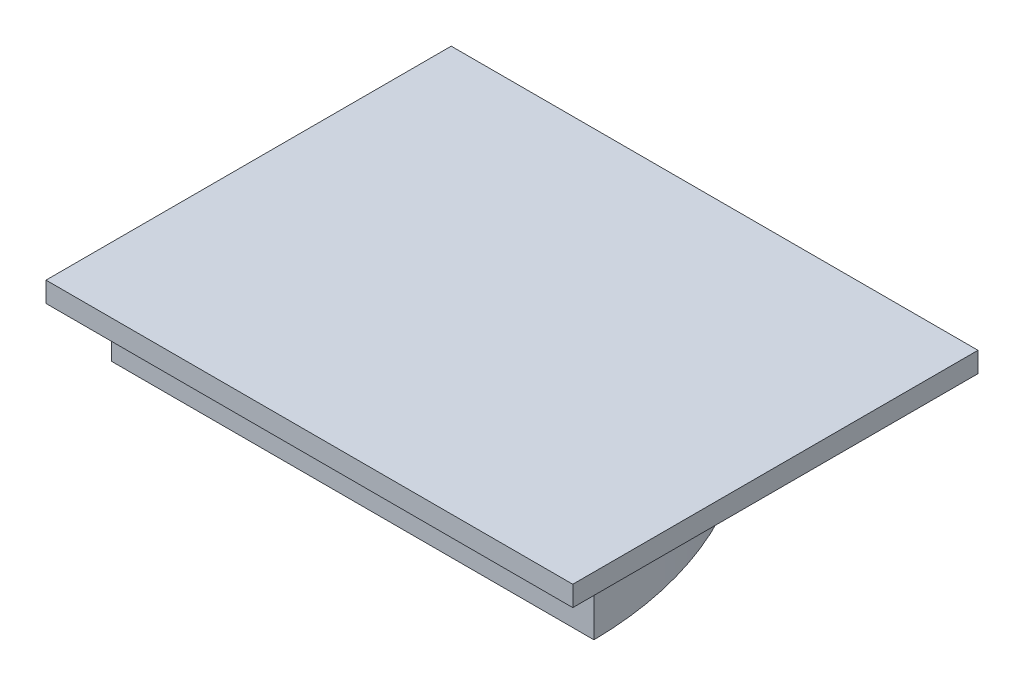
ISO-10303-21;
HEADER;
FILE_DESCRIPTION(('STEP AP214'),'2;1');
FILE_NAME('part.step','',(''),(''),'','','');
FILE_SCHEMA(('AUTOMOTIVE_DESIGN { 1 0 10303 214 1 1 1 1 }'));
ENDSEC;
DATA;
#1=APPLICATION_CONTEXT('core data for automotive mechanical design processes');
#2=APPLICATION_PROTOCOL_DEFINITION('international standard','automotive_design',2000,#1);
#3=PRODUCT_CONTEXT('',#1,'mechanical');
#4=PRODUCT('Part','Part','',(#3));
#5=PRODUCT_RELATED_PRODUCT_CATEGORY('part','',(#4));
#6=PRODUCT_DEFINITION_FORMATION('','',#4);
#7=PRODUCT_DEFINITION_CONTEXT('part definition',#1,'design');
#8=PRODUCT_DEFINITION('design','',#6,#7);
#9=PRODUCT_DEFINITION_SHAPE('','',#8);
#10=(LENGTH_UNIT() NAMED_UNIT(*) SI_UNIT(.MILLI.,.METRE.));
#11=(NAMED_UNIT(*) PLANE_ANGLE_UNIT() SI_UNIT($,.RADIAN.));
#12=(NAMED_UNIT(*) SI_UNIT($,.STERADIAN.) SOLID_ANGLE_UNIT());
#13=UNCERTAINTY_MEASURE_WITH_UNIT(LENGTH_MEASURE(1.E-05),#10,'distance_accuracy_value','');
#14=(GEOMETRIC_REPRESENTATION_CONTEXT(3) GLOBAL_UNCERTAINTY_ASSIGNED_CONTEXT((#13)) GLOBAL_UNIT_ASSIGNED_CONTEXT((#10,
#11,#12)) REPRESENTATION_CONTEXT('',''));
#15=CARTESIAN_POINT('',(0.,0.,0.));
#16=DIRECTION('',(0.,0.,1.));
#17=DIRECTION('',(1.,0.,0.));
#18=AXIS2_PLACEMENT_3D('',#15,#16,#17);
#19=CARTESIAN_POINT('',(-24.1770590491929,3.,10.1170212765957));
#20=DIRECTION('',(0.,0.,-1.));
#21=DIRECTION('',(-1.,0.,0.));
#22=AXIS2_PLACEMENT_3D('',#19,#20,#21);
#23=PLANE('',#22);
#24=DIRECTION('',(1.,0.,0.));
#25=VECTOR('',#24,1.);
#26=CARTESIAN_POINT('',(-24.1770590491929,0.,10.1170212765957));
#27=LINE('',#26,#25);
#28=CARTESIAN_POINT('',(-24.1770590491929,0.,10.1170212765957));
#29=VERTEX_POINT('',#28);
#30=CARTESIAN_POINT('',(-0.377059049192902,0.,10.1170212765957));
#31=VERTEX_POINT('',#30);
#32=EDGE_CURVE('E118',#29,#31,#27,.T.);
#33=ORIENTED_EDGE('',*,*,#32,.T.);
#34=DIRECTION('',(0.,-1.,0.));
#35=VECTOR('',#34,1.);
#36=CARTESIAN_POINT('',(-0.377059049192902,3.,10.1170212765957));
#37=LINE('',#36,#35);
#38=CARTESIAN_POINT('',(-0.377059049192902,3.,10.1170212765957));
#39=VERTEX_POINT('',#38);
#40=EDGE_CURVE('E126',#39,#31,#37,.T.);
#41=ORIENTED_EDGE('',*,*,#40,.F.);
#42=DIRECTION('',(1.,0.,0.));
#43=VECTOR('',#42,1.);
#44=CARTESIAN_POINT('',(-24.1770590491929,3.,10.1170212765957));
#45=LINE('',#44,#43);
#46=CARTESIAN_POINT('',(-24.1770590491929,3.,10.1170212765957));
#47=VERTEX_POINT('',#46);
#48=EDGE_CURVE('E123',#47,#39,#45,.T.);
#49=ORIENTED_EDGE('',*,*,#48,.F.);
#50=DIRECTION('',(0.,-1.,0.));
#51=VECTOR('',#50,1.);
#52=CARTESIAN_POINT('',(-24.1770590491929,3.,10.1170212765957));
#53=LINE('',#52,#51);
#54=EDGE_CURVE('E131',#47,#29,#53,.T.);
#55=ORIENTED_EDGE('',*,*,#54,.T.);
#56=EDGE_LOOP('',(#33,#41,#49,#55));
#57=FACE_BOUND('',#56,.T.);
#58=ADVANCED_FACE('F33',(#57),#23,.F.);
#59=CARTESIAN_POINT('',(0.,0.,0.));
#60=DIRECTION('',(0.,1.,0.));
#61=DIRECTION('',(0.,0.,1.));
#62=AXIS2_PLACEMENT_3D('',#59,#60,#61);
#63=PLANE('',#62);
#64=ORIENTED_EDGE('',*,*,#32,.F.);
#65=CARTESIAN_POINT('',(-5.97815798346919,0.,10.3170212765957));
#66=DIRECTION('',(0.,1.,0.));
#67=DIRECTION('',(0.,0.,1.));
#68=AXIS2_PLACEMENT_3D('',#65,#66,#67);
#69=CIRCLE('',#68,18.2);
#70=CARTESIAN_POINT('',(-12.2770590491929,0.,-6.75821943515484));
#71=VERTEX_POINT('',#70);
#72=EDGE_CURVE('E56',#29,#71,#69,.F.);
#73=ORIENTED_EDGE('',*,*,#72,.T.);
#74=CARTESIAN_POINT('',(-18.5759601149166,0.,10.3170212765957));
#75=DIRECTION('',(0.,1.,0.));
#76=DIRECTION('',(0.,0.,1.));
#77=AXIS2_PLACEMENT_3D('',#74,#75,#76);
#78=CIRCLE('',#77,18.2);
#79=EDGE_CURVE('E134',#71,#31,#78,.F.);
#80=ORIENTED_EDGE('',*,*,#79,.T.);
#81=EDGE_LOOP('',(#64,#73,#80));
#82=FACE_BOUND('',#81,.T.);
#83=ADVANCED_FACE('F143',(#82),#63,.F.);
#84=CARTESIAN_POINT('',(-18.5759601149166,3.,10.3170212765957));
#85=DIRECTION('',(0.,-1.,0.));
#86=DIRECTION('',(0.,0.,-1.));
#87=AXIS2_PLACEMENT_3D('',#84,#85,#86);
#88=CYLINDRICAL_SURFACE('',#87,18.2);
#89=DIRECTION('',(0.,-1.,0.));
#90=VECTOR('',#89,1.);
#91=CARTESIAN_POINT('',(-12.2770590491929,1.5,-6.75821943515484));
#92=LINE('',#91,#90);
#93=CARTESIAN_POINT('',(-12.2770590491929,3.,-6.75821943515484));
#94=VERTEX_POINT('',#93);
#95=EDGE_CURVE('E37',#94,#71,#92,.T.);
#96=ORIENTED_EDGE('',*,*,#95,.F.);
#97=CARTESIAN_POINT('',(-18.5759601149166,3.,10.3170212765957));
#98=DIRECTION('',(0.,1.,0.));
#99=DIRECTION('',(0.,0.,1.));
#100=AXIS2_PLACEMENT_3D('',#97,#98,#99);
#101=CIRCLE('',#100,18.2);
#102=EDGE_CURVE('E42',#39,#94,#101,.T.);
#103=ORIENTED_EDGE('',*,*,#102,.F.);
#104=ORIENTED_EDGE('',*,*,#40,.T.);
#105=ORIENTED_EDGE('',*,*,#79,.F.);
#106=EDGE_LOOP('',(#96,#103,#104,#105));
#107=FACE_BOUND('',#106,.T.);
#108=ADVANCED_FACE('F35',(#107),#88,.T.);
#109=CARTESIAN_POINT('',(-5.97815798346919,3.,10.3170212765957));
#110=DIRECTION('',(0.,1.,0.));
#111=DIRECTION('',(0.,0.,1.));
#112=AXIS2_PLACEMENT_3D('',#109,#110,#111);
#113=CYLINDRICAL_SURFACE('',#112,18.2);
#114=CARTESIAN_POINT('',(-5.97815798346919,3.,10.3170212765957));
#115=DIRECTION('',(0.,1.,0.));
#116=DIRECTION('',(0.,0.,1.));
#117=AXIS2_PLACEMENT_3D('',#114,#115,#116);
#118=CIRCLE('',#117,18.2);
#119=EDGE_CURVE('E11',#94,#47,#118,.T.);
#120=ORIENTED_EDGE('',*,*,#119,.F.);
#121=ORIENTED_EDGE('',*,*,#95,.T.);
#122=ORIENTED_EDGE('',*,*,#72,.F.);
#123=ORIENTED_EDGE('',*,*,#54,.F.);
#124=EDGE_LOOP('',(#120,#121,#122,#123));
#125=FACE_BOUND('',#124,.T.);
#126=ADVANCED_FACE('F145',(#125),#113,.T.);
#127=CARTESIAN_POINT('',(0.,3.,0.));
#128=DIRECTION('',(0.,1.,0.));
#129=DIRECTION('',(0.,0.,1.));
#130=AXIS2_PLACEMENT_3D('',#127,#128,#129);
#131=PLANE('',#130);
#132=DIRECTION('',(0.,0.,-1.));
#133=VECTOR('',#132,1.);
#134=CARTESIAN_POINT('',(0.722940950807095,3.,-7.7379737560934));
#135=LINE('',#134,#133);
#136=CARTESIAN_POINT('',(0.722940950807098,3.,12.2620262439066));
#137=VERTEX_POINT('',#136);
#138=CARTESIAN_POINT('',(0.722940950807095,3.,-7.7379737560934));
#139=VERTEX_POINT('',#138);
#140=EDGE_CURVE('E116',#137,#139,#135,.T.);
#141=ORIENTED_EDGE('',*,*,#140,.F.);
#142=DIRECTION('',(1.,0.,0.));
#143=VECTOR('',#142,1.);
#144=CARTESIAN_POINT('',(-25.2770590491929,3.,12.2620262439066));
#145=LINE('',#144,#143);
#146=CARTESIAN_POINT('',(-25.2770590491929,3.,12.2620262439066));
#147=VERTEX_POINT('',#146);
#148=EDGE_CURVE('E112',#147,#137,#145,.T.);
#149=ORIENTED_EDGE('',*,*,#148,.F.);
#150=DIRECTION('',(0.,0.,1.));
#151=VECTOR('',#150,1.);
#152=CARTESIAN_POINT('',(-25.2770590491929,3.,-7.7379737560934));
#153=LINE('',#152,#151);
#154=CARTESIAN_POINT('',(-25.2770590491929,3.,-7.7379737560934));
#155=VERTEX_POINT('',#154);
#156=EDGE_CURVE('E234',#155,#147,#153,.T.);
#157=ORIENTED_EDGE('',*,*,#156,.F.);
#158=DIRECTION('',(-1.,0.,0.));
#159=VECTOR('',#158,1.);
#160=CARTESIAN_POINT('',(-25.2770590491929,3.,-7.7379737560934));
#161=LINE('',#160,#159);
#162=EDGE_CURVE('E237',#139,#155,#161,.T.);
#163=ORIENTED_EDGE('',*,*,#162,.F.);
#164=EDGE_LOOP('',(#141,#149,#157,#163));
#165=FACE_BOUND('',#164,.T.);
#166=ORIENTED_EDGE('',*,*,#48,.T.);
#167=ORIENTED_EDGE('',*,*,#102,.T.);
#168=ORIENTED_EDGE('',*,*,#119,.T.);
#169=EDGE_LOOP('',(#166,#167,#168));
#170=FACE_BOUND('',#169,.T.);
#171=ADVANCED_FACE('F139',(#165,#170),#131,.F.);
#172=CARTESIAN_POINT('',(0.722940950807095,4.,-7.7379737560934));
#173=DIRECTION('',(-1.,0.,0.));
#174=DIRECTION('',(0.,0.,1.));
#175=AXIS2_PLACEMENT_3D('',#172,#173,#174);
#176=PLANE('',#175);
#177=ORIENTED_EDGE('',*,*,#140,.T.);
#178=DIRECTION('',(0.,-1.,0.));
#179=VECTOR('',#178,1.);
#180=CARTESIAN_POINT('',(0.722940950807095,4.,-7.7379737560934));
#181=LINE('',#180,#179);
#182=CARTESIAN_POINT('',(0.722940950807095,4.,-7.7379737560934));
#183=VERTEX_POINT('',#182);
#184=EDGE_CURVE('E96',#183,#139,#181,.T.);
#185=ORIENTED_EDGE('',*,*,#184,.F.);
#186=DIRECTION('',(0.,0.,-1.));
#187=VECTOR('',#186,1.);
#188=CARTESIAN_POINT('',(0.722940950807095,4.,-7.7379737560934));
#189=LINE('',#188,#187);
#190=CARTESIAN_POINT('',(0.722940950807098,4.,12.2620262439066));
#191=VERTEX_POINT('',#190);
#192=EDGE_CURVE('E103',#191,#183,#189,.T.);
#193=ORIENTED_EDGE('',*,*,#192,.F.);
#194=DIRECTION('',(0.,-1.,0.));
#195=VECTOR('',#194,1.);
#196=CARTESIAN_POINT('',(0.722940950807098,4.,12.2620262439066));
#197=LINE('',#196,#195);
#198=EDGE_CURVE('E231',#191,#137,#197,.T.);
#199=ORIENTED_EDGE('',*,*,#198,.T.);
#200=EDGE_LOOP('',(#177,#185,#193,#199));
#201=FACE_BOUND('',#200,.T.);
#202=ADVANCED_FACE('F114',(#201),#176,.F.);
#203=CARTESIAN_POINT('',(-25.2770590491929,4.,-7.7379737560934));
#204=DIRECTION('',(0.,0.,1.));
#205=DIRECTION('',(1.,0.,0.));
#206=AXIS2_PLACEMENT_3D('',#203,#204,#205);
#207=PLANE('',#206);
#208=ORIENTED_EDGE('',*,*,#162,.T.);
#209=DIRECTION('',(0.,-1.,0.));
#210=VECTOR('',#209,1.);
#211=CARTESIAN_POINT('',(-25.2770590491929,4.,-7.7379737560934));
#212=LINE('',#211,#210);
#213=CARTESIAN_POINT('',(-25.2770590491929,4.,-7.7379737560934));
#214=VERTEX_POINT('',#213);
#215=EDGE_CURVE('E99',#214,#155,#212,.T.);
#216=ORIENTED_EDGE('',*,*,#215,.F.);
#217=DIRECTION('',(-1.,0.,0.));
#218=VECTOR('',#217,1.);
#219=CARTESIAN_POINT('',(-25.2770590491929,4.,-7.7379737560934));
#220=LINE('',#219,#218);
#221=EDGE_CURVE('E92',#183,#214,#220,.T.);
#222=ORIENTED_EDGE('',*,*,#221,.F.);
#223=ORIENTED_EDGE('',*,*,#184,.T.);
#224=EDGE_LOOP('',(#208,#216,#222,#223));
#225=FACE_BOUND('',#224,.T.);
#226=ADVANCED_FACE('F94',(#225),#207,.F.);
#227=CARTESIAN_POINT('',(-25.2770590491929,4.,-7.7379737560934));
#228=DIRECTION('',(1.,0.,0.));
#229=DIRECTION('',(0.,0.,-1.));
#230=AXIS2_PLACEMENT_3D('',#227,#228,#229);
#231=PLANE('',#230);
#232=ORIENTED_EDGE('',*,*,#156,.T.);
#233=DIRECTION('',(0.,-1.,0.));
#234=VECTOR('',#233,1.);
#235=CARTESIAN_POINT('',(-25.2770590491929,4.,12.2620262439066));
#236=LINE('',#235,#234);
#237=CARTESIAN_POINT('',(-25.2770590491929,4.,12.2620262439066));
#238=VERTEX_POINT('',#237);
#239=EDGE_CURVE('E119',#238,#147,#236,.T.);
#240=ORIENTED_EDGE('',*,*,#239,.F.);
#241=DIRECTION('',(0.,0.,1.));
#242=VECTOR('',#241,1.);
#243=CARTESIAN_POINT('',(-25.2770590491929,4.,-7.7379737560934));
#244=LINE('',#243,#242);
#245=EDGE_CURVE('E102',#214,#238,#244,.T.);
#246=ORIENTED_EDGE('',*,*,#245,.F.);
#247=ORIENTED_EDGE('',*,*,#215,.T.);
#248=EDGE_LOOP('',(#232,#240,#246,#247));
#249=FACE_BOUND('',#248,.T.);
#250=ADVANCED_FACE('F164',(#249),#231,.F.);
#251=CARTESIAN_POINT('',(-25.2770590491929,4.,12.2620262439066));
#252=DIRECTION('',(0.,0.,-1.));
#253=DIRECTION('',(-1.,0.,0.));
#254=AXIS2_PLACEMENT_3D('',#251,#252,#253);
#255=PLANE('',#254);
#256=ORIENTED_EDGE('',*,*,#148,.T.);
#257=ORIENTED_EDGE('',*,*,#198,.F.);
#258=DIRECTION('',(1.,0.,0.));
#259=VECTOR('',#258,1.);
#260=CARTESIAN_POINT('',(-25.2770590491929,4.,12.2620262439066));
#261=LINE('',#260,#259);
#262=EDGE_CURVE('E108',#238,#191,#261,.T.);
#263=ORIENTED_EDGE('',*,*,#262,.F.);
#264=ORIENTED_EDGE('',*,*,#239,.T.);
#265=EDGE_LOOP('',(#256,#257,#263,#264));
#266=FACE_BOUND('',#265,.T.);
#267=ADVANCED_FACE('F167',(#266),#255,.F.);
#268=CARTESIAN_POINT('',(0.,4.,0.));
#269=DIRECTION('',(0.,1.,0.));
#270=DIRECTION('',(0.,0.,1.));
#271=AXIS2_PLACEMENT_3D('',#268,#269,#270);
#272=PLANE('',#271);
#273=ORIENTED_EDGE('',*,*,#192,.T.);
#274=ORIENTED_EDGE('',*,*,#221,.T.);
#275=ORIENTED_EDGE('',*,*,#245,.T.);
#276=ORIENTED_EDGE('',*,*,#262,.T.);
#277=EDGE_LOOP('',(#273,#274,#275,#276));
#278=FACE_BOUND('',#277,.T.);
#279=ADVANCED_FACE('F106',(#278),#272,.T.);
#280=CLOSED_SHELL('',(#58,#83,#108,#126,#171,#202,#226,#250,#267,#279));
#281=MANIFOLD_SOLID_BREP('B2',#280);
#282=ADVANCED_BREP_SHAPE_REPRESENTATION('',(#18,#281),#14);
#283=SHAPE_DEFINITION_REPRESENTATION(#9,#282);
ENDSEC;
END-ISO-10303-21;
